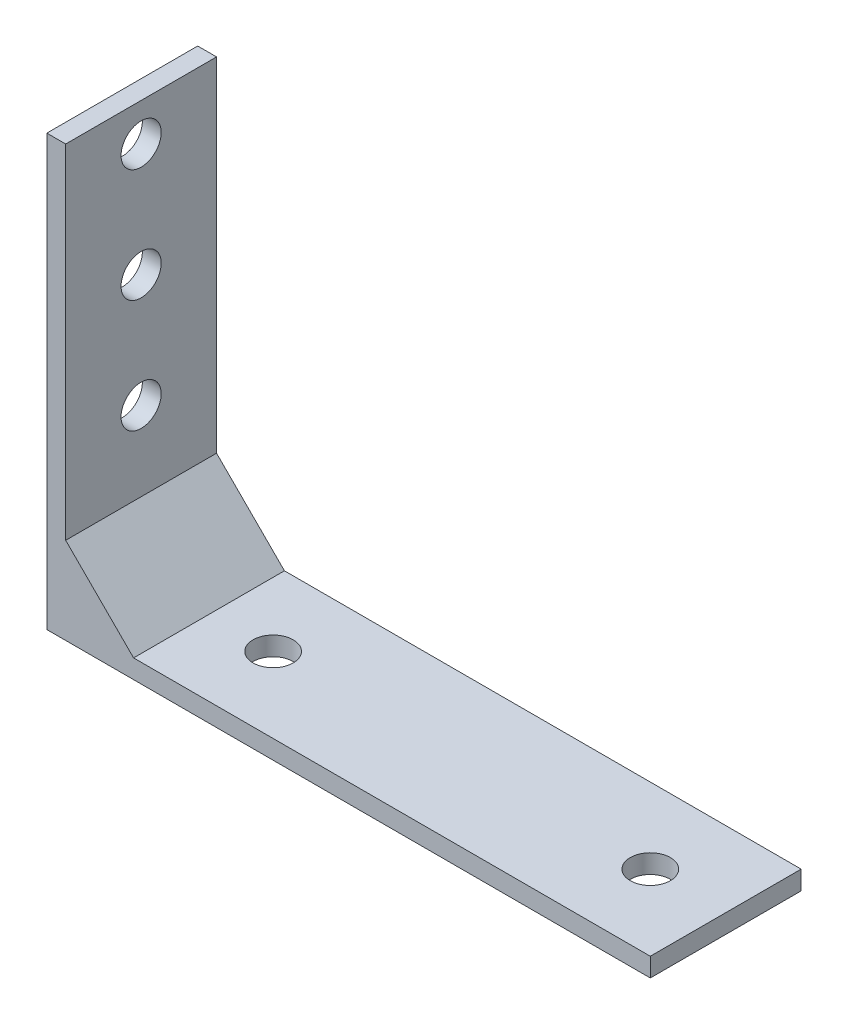
ISO-10303-21;
HEADER;
FILE_DESCRIPTION(('STEP AP214'),'2;1');
FILE_NAME('part.step','',(''),(''),'','','');
FILE_SCHEMA(('AUTOMOTIVE_DESIGN { 1 0 10303 214 1 1 1 1 }'));
ENDSEC;
DATA;
#1=APPLICATION_CONTEXT('core data for automotive mechanical design processes');
#2=APPLICATION_PROTOCOL_DEFINITION('international standard','automotive_design',2000,#1);
#3=PRODUCT_CONTEXT('',#1,'mechanical');
#4=PRODUCT('Part','Part','',(#3));
#5=PRODUCT_RELATED_PRODUCT_CATEGORY('part','',(#4));
#6=PRODUCT_DEFINITION_FORMATION('','',#4);
#7=PRODUCT_DEFINITION_CONTEXT('part definition',#1,'design');
#8=PRODUCT_DEFINITION('design','',#6,#7);
#9=PRODUCT_DEFINITION_SHAPE('','',#8);
#10=(LENGTH_UNIT() NAMED_UNIT(*) SI_UNIT(.MILLI.,.METRE.));
#11=(NAMED_UNIT(*) PLANE_ANGLE_UNIT() SI_UNIT($,.RADIAN.));
#12=(NAMED_UNIT(*) SI_UNIT($,.STERADIAN.) SOLID_ANGLE_UNIT());
#13=UNCERTAINTY_MEASURE_WITH_UNIT(LENGTH_MEASURE(1.E-05),#10,'distance_accuracy_value','');
#14=(GEOMETRIC_REPRESENTATION_CONTEXT(3) GLOBAL_UNCERTAINTY_ASSIGNED_CONTEXT((#13)) GLOBAL_UNIT_ASSIGNED_CONTEXT((#10,
#11,#12)) REPRESENTATION_CONTEXT('',''));
#15=CARTESIAN_POINT('',(0.,0.,0.));
#16=DIRECTION('',(0.,0.,1.));
#17=DIRECTION('',(1.,0.,0.));
#18=AXIS2_PLACEMENT_3D('',#15,#16,#17);
#19=CARTESIAN_POINT('',(0.,0.,25.4));
#20=DIRECTION('',(0.,1.,0.));
#21=DIRECTION('',(0.,0.,1.));
#22=AXIS2_PLACEMENT_3D('',#19,#20,#21);
#23=PLANE('',#22);
#24=CARTESIAN_POINT('',(25.4,0.,12.7));
#25=DIRECTION('',(0.,1.,0.));
#26=DIRECTION('',(0.,0.,1.));
#27=AXIS2_PLACEMENT_3D('',#24,#25,#26);
#28=CIRCLE('',#27,3.3782);
#29=CARTESIAN_POINT('',(25.4,0.,16.0782));
#30=VERTEX_POINT('',#29);
#31=EDGE_CURVE('E170',#30,#30,#28,.T.);
#32=ORIENTED_EDGE('',*,*,#31,.T.);
#33=EDGE_LOOP('',(#32));
#34=FACE_BOUND('',#33,.T.);
#35=CARTESIAN_POINT('',(88.9,0.,12.7));
#36=DIRECTION('',(0.,1.,0.));
#37=DIRECTION('',(0.,0.,1.));
#38=AXIS2_PLACEMENT_3D('',#35,#36,#37);
#39=CIRCLE('',#38,3.37819999999999);
#40=CARTESIAN_POINT('',(88.9,0.,16.0782));
#41=VERTEX_POINT('',#40);
#42=EDGE_CURVE('E130',#41,#41,#39,.T.);
#43=ORIENTED_EDGE('',*,*,#42,.T.);
#44=EDGE_LOOP('',(#43));
#45=FACE_BOUND('',#44,.T.);
#46=DIRECTION('',(1.,0.,0.));
#47=VECTOR('',#46,1.);
#48=CARTESIAN_POINT('',(0.,0.,0.));
#49=LINE('',#48,#47);
#50=CARTESIAN_POINT('',(0.,0.,0.));
#51=VERTEX_POINT('',#50);
#52=CARTESIAN_POINT('',(101.6,0.,0.));
#53=VERTEX_POINT('',#52);
#54=EDGE_CURVE('E127',#51,#53,#49,.T.);
#55=ORIENTED_EDGE('',*,*,#54,.T.);
#56=DIRECTION('',(0.,0.,-1.));
#57=VECTOR('',#56,1.);
#58=CARTESIAN_POINT('',(101.6,0.,25.4));
#59=LINE('',#58,#57);
#60=CARTESIAN_POINT('',(101.6,0.,25.4));
#61=VERTEX_POINT('',#60);
#62=EDGE_CURVE('E11',#61,#53,#59,.T.);
#63=ORIENTED_EDGE('',*,*,#62,.F.);
#64=DIRECTION('',(1.,0.,0.));
#65=VECTOR('',#64,1.);
#66=CARTESIAN_POINT('',(0.,0.,25.4));
#67=LINE('',#66,#65);
#68=CARTESIAN_POINT('',(0.,0.,25.4));
#69=VERTEX_POINT('',#68);
#70=EDGE_CURVE('E141',#69,#61,#67,.T.);
#71=ORIENTED_EDGE('',*,*,#70,.F.);
#72=DIRECTION('',(0.,0.,-1.));
#73=VECTOR('',#72,1.);
#74=CARTESIAN_POINT('',(0.,0.,25.4));
#75=LINE('',#74,#73);
#76=EDGE_CURVE('E58',#69,#51,#75,.T.);
#77=ORIENTED_EDGE('',*,*,#76,.T.);
#78=EDGE_LOOP('',(#55,#63,#71,#77));
#79=FACE_BOUND('',#78,.T.);
#80=ADVANCED_FACE('F35',(#34,#45,#79),#23,.F.);
#81=CARTESIAN_POINT('',(101.6,0.,25.4));
#82=DIRECTION('',(-1.,0.,0.));
#83=DIRECTION('',(0.,0.,1.));
#84=AXIS2_PLACEMENT_3D('',#81,#82,#83);
#85=PLANE('',#84);
#86=DIRECTION('',(0.,1.,0.));
#87=VECTOR('',#86,1.);
#88=CARTESIAN_POINT('',(101.6,0.,0.));
#89=LINE('',#88,#87);
#90=CARTESIAN_POINT('',(101.6,3.175,0.));
#91=VERTEX_POINT('',#90);
#92=EDGE_CURVE('E129',#53,#91,#89,.T.);
#93=ORIENTED_EDGE('',*,*,#92,.T.);
#94=DIRECTION('',(0.,0.,-1.));
#95=VECTOR('',#94,1.);
#96=CARTESIAN_POINT('',(101.6,3.175,25.4));
#97=LINE('',#96,#95);
#98=CARTESIAN_POINT('',(101.6,3.175,25.4));
#99=VERTEX_POINT('',#98);
#100=EDGE_CURVE('E42',#99,#91,#97,.T.);
#101=ORIENTED_EDGE('',*,*,#100,.F.);
#102=DIRECTION('',(0.,1.,0.));
#103=VECTOR('',#102,1.);
#104=CARTESIAN_POINT('',(101.6,0.,25.4));
#105=LINE('',#104,#103);
#106=EDGE_CURVE('E87',#61,#99,#105,.T.);
#107=ORIENTED_EDGE('',*,*,#106,.F.);
#108=ORIENTED_EDGE('',*,*,#62,.T.);
#109=EDGE_LOOP('',(#93,#101,#107,#108));
#110=FACE_BOUND('',#109,.T.);
#111=ADVANCED_FACE('F149',(#110),#85,.F.);
#112=CARTESIAN_POINT('',(0.,3.175,25.4));
#113=DIRECTION('',(0.,1.,0.));
#114=DIRECTION('',(-1.,0.,0.));
#115=AXIS2_PLACEMENT_3D('',#112,#113,#114);
#116=PLANE('',#115);
#117=DIRECTION('',(0.,0.,1.));
#118=VECTOR('',#117,1.);
#119=CARTESIAN_POINT('',(14.6049999999999,3.175,0.));
#120=LINE('',#119,#118);
#121=CARTESIAN_POINT('',(14.6049999999999,3.175,0.));
#122=VERTEX_POINT('',#121);
#123=CARTESIAN_POINT('',(14.6049999999999,3.175,25.4));
#124=VERTEX_POINT('',#123);
#125=EDGE_CURVE('E158',#122,#124,#120,.T.);
#126=ORIENTED_EDGE('',*,*,#125,.T.);
#127=DIRECTION('',(1.,0.,0.));
#128=VECTOR('',#127,1.);
#129=CARTESIAN_POINT('',(0.,3.175,25.4));
#130=LINE('',#129,#128);
#131=EDGE_CURVE('E110',#124,#99,#130,.T.);
#132=ORIENTED_EDGE('',*,*,#131,.T.);
#133=ORIENTED_EDGE('',*,*,#100,.T.);
#134=DIRECTION('',(1.,0.,0.));
#135=VECTOR('',#134,1.);
#136=CARTESIAN_POINT('',(0.,3.175,0.));
#137=LINE('',#136,#135);
#138=EDGE_CURVE('E133',#122,#91,#137,.T.);
#139=ORIENTED_EDGE('',*,*,#138,.F.);
#140=EDGE_LOOP('',(#126,#132,#133,#139));
#141=FACE_BOUND('',#140,.T.);
#142=CARTESIAN_POINT('',(25.4,3.175,12.7));
#143=DIRECTION('',(0.,1.,0.));
#144=DIRECTION('',(0.,0.,1.));
#145=AXIS2_PLACEMENT_3D('',#142,#143,#144);
#146=CIRCLE('',#145,3.3782);
#147=CARTESIAN_POINT('',(25.4,3.175,16.0782));
#148=VERTEX_POINT('',#147);
#149=EDGE_CURVE('E173',#148,#148,#146,.T.);
#150=ORIENTED_EDGE('',*,*,#149,.F.);
#151=EDGE_LOOP('',(#150));
#152=FACE_BOUND('',#151,.T.);
#153=CARTESIAN_POINT('',(88.9,3.175,12.7));
#154=DIRECTION('',(0.,1.,0.));
#155=DIRECTION('',(0.,0.,1.));
#156=AXIS2_PLACEMENT_3D('',#153,#154,#155);
#157=CIRCLE('',#156,3.37819999999999);
#158=CARTESIAN_POINT('',(88.9,3.175,16.0782));
#159=VERTEX_POINT('',#158);
#160=EDGE_CURVE('E167',#159,#159,#157,.T.);
#161=ORIENTED_EDGE('',*,*,#160,.F.);
#162=EDGE_LOOP('',(#161));
#163=FACE_BOUND('',#162,.T.);
#164=ADVANCED_FACE('F147',(#141,#152,#163),#116,.T.);
#165=CARTESIAN_POINT('',(3.175,0.,25.4));
#166=DIRECTION('',(-1.,0.,0.));
#167=DIRECTION('',(0.,-1.,0.));
#168=AXIS2_PLACEMENT_3D('',#165,#166,#167);
#169=PLANE('',#168);
#170=CARTESIAN_POINT('',(3.175,66.04,12.7));
#171=DIRECTION('',(-1.,0.,0.));
#172=DIRECTION('',(0.,-1.,0.));
#173=AXIS2_PLACEMENT_3D('',#170,#171,#172);
#174=CIRCLE('',#173,3.3782);
#175=CARTESIAN_POINT('',(3.175,62.6618,12.7));
#176=VERTEX_POINT('',#175);
#177=EDGE_CURVE('E188',#176,#176,#174,.T.);
#178=ORIENTED_EDGE('',*,*,#177,.T.);
#179=EDGE_LOOP('',(#178));
#180=FACE_BOUND('',#179,.T.);
#181=CARTESIAN_POINT('',(3.175,46.99,12.7));
#182=DIRECTION('',(-1.,0.,0.));
#183=DIRECTION('',(0.,-1.,0.));
#184=AXIS2_PLACEMENT_3D('',#181,#182,#183);
#185=CIRCLE('',#184,3.3782);
#186=CARTESIAN_POINT('',(3.175,43.6118,12.7));
#187=VERTEX_POINT('',#186);
#188=EDGE_CURVE('E182',#187,#187,#185,.T.);
#189=ORIENTED_EDGE('',*,*,#188,.T.);
#190=EDGE_LOOP('',(#189));
#191=FACE_BOUND('',#190,.T.);
#192=CARTESIAN_POINT('',(3.175,27.94,12.7));
#193=DIRECTION('',(-1.,0.,0.));
#194=DIRECTION('',(0.,-1.,0.));
#195=AXIS2_PLACEMENT_3D('',#192,#193,#194);
#196=CIRCLE('',#195,3.3782);
#197=CARTESIAN_POINT('',(3.175,24.5618,12.7));
#198=VERTEX_POINT('',#197);
#199=EDGE_CURVE('E176',#198,#198,#196,.T.);
#200=ORIENTED_EDGE('',*,*,#199,.T.);
#201=EDGE_LOOP('',(#200));
#202=FACE_BOUND('',#201,.T.);
#203=DIRECTION('',(0.,1.,0.));
#204=VECTOR('',#203,1.);
#205=CARTESIAN_POINT('',(3.175,0.,25.4));
#206=LINE('',#205,#204);
#207=CARTESIAN_POINT('',(3.175,14.605,25.4));
#208=VERTEX_POINT('',#207);
#209=CARTESIAN_POINT('',(3.175,72.39,25.4));
#210=VERTEX_POINT('',#209);
#211=EDGE_CURVE('E99',#208,#210,#206,.T.);
#212=ORIENTED_EDGE('',*,*,#211,.F.);
#213=DIRECTION('',(0.,0.,1.));
#214=VECTOR('',#213,1.);
#215=CARTESIAN_POINT('',(3.175,14.605,0.));
#216=LINE('',#215,#214);
#217=CARTESIAN_POINT('',(3.175,14.605,0.));
#218=VERTEX_POINT('',#217);
#219=EDGE_CURVE('E159',#218,#208,#216,.T.);
#220=ORIENTED_EDGE('',*,*,#219,.F.);
#221=DIRECTION('',(0.,1.,0.));
#222=VECTOR('',#221,1.);
#223=CARTESIAN_POINT('',(3.175,0.,0.));
#224=LINE('',#223,#222);
#225=CARTESIAN_POINT('',(3.175,72.39,0.));
#226=VERTEX_POINT('',#225);
#227=EDGE_CURVE('E115',#218,#226,#224,.T.);
#228=ORIENTED_EDGE('',*,*,#227,.T.);
#229=DIRECTION('',(0.,0.,-1.));
#230=VECTOR('',#229,1.);
#231=CARTESIAN_POINT('',(3.175,72.39,25.4));
#232=LINE('',#231,#230);
#233=EDGE_CURVE('E113',#210,#226,#232,.T.);
#234=ORIENTED_EDGE('',*,*,#233,.F.);
#235=EDGE_LOOP('',(#212,#220,#228,#234));
#236=FACE_BOUND('',#235,.T.);
#237=ADVANCED_FACE('F114',(#180,#191,#202,#236),#169,.F.);
#238=CARTESIAN_POINT('',(0.,72.39,25.4));
#239=DIRECTION('',(0.,1.,0.));
#240=DIRECTION('',(0.,0.,1.));
#241=AXIS2_PLACEMENT_3D('',#238,#239,#240);
#242=PLANE('',#241);
#243=DIRECTION('',(1.,0.,0.));
#244=VECTOR('',#243,1.);
#245=CARTESIAN_POINT('',(0.,72.39,0.));
#246=LINE('',#245,#244);
#247=CARTESIAN_POINT('',(0.,72.39,0.));
#248=VERTEX_POINT('',#247);
#249=EDGE_CURVE('E136',#248,#226,#246,.T.);
#250=ORIENTED_EDGE('',*,*,#249,.F.);
#251=DIRECTION('',(0.,0.,-1.));
#252=VECTOR('',#251,1.);
#253=CARTESIAN_POINT('',(0.,72.39,25.4));
#254=LINE('',#253,#252);
#255=CARTESIAN_POINT('',(0.,72.39,25.4));
#256=VERTEX_POINT('',#255);
#257=EDGE_CURVE('E119',#256,#248,#254,.T.);
#258=ORIENTED_EDGE('',*,*,#257,.F.);
#259=DIRECTION('',(1.,0.,0.));
#260=VECTOR('',#259,1.);
#261=CARTESIAN_POINT('',(0.,72.39,25.4));
#262=LINE('',#261,#260);
#263=EDGE_CURVE('E104',#256,#210,#262,.T.);
#264=ORIENTED_EDGE('',*,*,#263,.T.);
#265=ORIENTED_EDGE('',*,*,#233,.T.);
#266=EDGE_LOOP('',(#250,#258,#264,#265));
#267=FACE_BOUND('',#266,.T.);
#268=ADVANCED_FACE('F121',(#267),#242,.T.);
#269=CARTESIAN_POINT('',(0.,0.,25.4));
#270=DIRECTION('',(-1.,0.,0.));
#271=DIRECTION('',(0.,0.,1.));
#272=AXIS2_PLACEMENT_3D('',#269,#270,#271);
#273=PLANE('',#272);
#274=CARTESIAN_POINT('',(0.,66.04,12.7));
#275=DIRECTION('',(-1.,0.,0.));
#276=DIRECTION('',(0.,0.,1.));
#277=AXIS2_PLACEMENT_3D('',#274,#275,#276);
#278=CIRCLE('',#277,3.3782);
#279=CARTESIAN_POINT('',(0.,66.04,16.0782));
#280=VERTEX_POINT('',#279);
#281=EDGE_CURVE('E191',#280,#280,#278,.T.);
#282=ORIENTED_EDGE('',*,*,#281,.F.);
#283=EDGE_LOOP('',(#282));
#284=FACE_BOUND('',#283,.T.);
#285=CARTESIAN_POINT('',(0.,46.99,12.7));
#286=DIRECTION('',(-1.,0.,0.));
#287=DIRECTION('',(0.,0.,1.));
#288=AXIS2_PLACEMENT_3D('',#285,#286,#287);
#289=CIRCLE('',#288,3.3782);
#290=CARTESIAN_POINT('',(0.,46.99,16.0782));
#291=VERTEX_POINT('',#290);
#292=EDGE_CURVE('E185',#291,#291,#289,.T.);
#293=ORIENTED_EDGE('',*,*,#292,.F.);
#294=EDGE_LOOP('',(#293));
#295=FACE_BOUND('',#294,.T.);
#296=CARTESIAN_POINT('',(0.,27.94,12.7));
#297=DIRECTION('',(-1.,0.,0.));
#298=DIRECTION('',(0.,0.,1.));
#299=AXIS2_PLACEMENT_3D('',#296,#297,#298);
#300=CIRCLE('',#299,3.3782);
#301=CARTESIAN_POINT('',(0.,27.94,16.0782));
#302=VERTEX_POINT('',#301);
#303=EDGE_CURVE('E179',#302,#302,#300,.T.);
#304=ORIENTED_EDGE('',*,*,#303,.F.);
#305=EDGE_LOOP('',(#304));
#306=FACE_BOUND('',#305,.T.);
#307=DIRECTION('',(0.,1.,0.));
#308=VECTOR('',#307,1.);
#309=CARTESIAN_POINT('',(0.,0.,0.));
#310=LINE('',#309,#308);
#311=EDGE_CURVE('E138',#51,#248,#310,.T.);
#312=ORIENTED_EDGE('',*,*,#311,.F.);
#313=ORIENTED_EDGE('',*,*,#76,.F.);
#314=DIRECTION('',(0.,1.,0.));
#315=VECTOR('',#314,1.);
#316=CARTESIAN_POINT('',(0.,0.,25.4));
#317=LINE('',#316,#315);
#318=EDGE_CURVE('E122',#69,#256,#317,.T.);
#319=ORIENTED_EDGE('',*,*,#318,.T.);
#320=ORIENTED_EDGE('',*,*,#257,.T.);
#321=EDGE_LOOP('',(#312,#313,#319,#320));
#322=FACE_BOUND('',#321,.T.);
#323=ADVANCED_FACE('F152',(#284,#295,#306,#322),#273,.T.);
#324=CARTESIAN_POINT('',(0.,0.,25.4));
#325=DIRECTION('',(0.,0.,1.));
#326=DIRECTION('',(1.,0.,0.));
#327=AXIS2_PLACEMENT_3D('',#324,#325,#326);
#328=PLANE('',#327);
#329=DIRECTION('',(-0.707106781186544,0.707106781186551,0.));
#330=VECTOR('',#329,1.);
#331=CARTESIAN_POINT('',(3.175,14.605,25.4));
#332=LINE('',#331,#330);
#333=EDGE_CURVE('E107',#124,#208,#332,.T.);
#334=ORIENTED_EDGE('',*,*,#333,.T.);
#335=ORIENTED_EDGE('',*,*,#211,.T.);
#336=ORIENTED_EDGE('',*,*,#263,.F.);
#337=ORIENTED_EDGE('',*,*,#318,.F.);
#338=ORIENTED_EDGE('',*,*,#70,.T.);
#339=ORIENTED_EDGE('',*,*,#106,.T.);
#340=ORIENTED_EDGE('',*,*,#131,.F.);
#341=EDGE_LOOP('',(#334,#335,#336,#337,#338,#339,#340));
#342=FACE_BOUND('',#341,.T.);
#343=ADVANCED_FACE('F101',(#342),#328,.T.);
#344=CARTESIAN_POINT('',(0.,0.,0.));
#345=DIRECTION('',(0.,0.,1.));
#346=DIRECTION('',(1.,0.,0.));
#347=AXIS2_PLACEMENT_3D('',#344,#345,#346);
#348=PLANE('',#347);
#349=ORIENTED_EDGE('',*,*,#227,.F.);
#350=DIRECTION('',(-0.707106781186544,0.707106781186551,0.));
#351=VECTOR('',#350,1.);
#352=CARTESIAN_POINT('',(3.175,14.605,0.));
#353=LINE('',#352,#351);
#354=EDGE_CURVE('E49',#122,#218,#353,.T.);
#355=ORIENTED_EDGE('',*,*,#354,.F.);
#356=ORIENTED_EDGE('',*,*,#138,.T.);
#357=ORIENTED_EDGE('',*,*,#92,.F.);
#358=ORIENTED_EDGE('',*,*,#54,.F.);
#359=ORIENTED_EDGE('',*,*,#311,.T.);
#360=ORIENTED_EDGE('',*,*,#249,.T.);
#361=EDGE_LOOP('',(#349,#355,#356,#357,#358,#359,#360));
#362=FACE_BOUND('',#361,.T.);
#363=ADVANCED_FACE('F151',(#362),#348,.F.);
#364=CARTESIAN_POINT('',(88.9,-22.225,12.7));
#365=DIRECTION('',(0.,1.,0.));
#366=DIRECTION('',(0.,0.,1.));
#367=AXIS2_PLACEMENT_3D('',#364,#365,#366);
#368=CYLINDRICAL_SURFACE('',#367,3.37819999999999);
#369=ORIENTED_EDGE('',*,*,#160,.T.);
#370=EDGE_LOOP('',(#369));
#371=FACE_BOUND('',#370,.T.);
#372=ORIENTED_EDGE('',*,*,#42,.F.);
#373=EDGE_LOOP('',(#372));
#374=FACE_BOUND('',#373,.T.);
#375=ADVANCED_FACE('F234',(#371,#374),#368,.F.);
#376=CARTESIAN_POINT('',(25.4,-22.225,12.7));
#377=DIRECTION('',(0.,1.,0.));
#378=DIRECTION('',(0.,0.,1.));
#379=AXIS2_PLACEMENT_3D('',#376,#377,#378);
#380=CYLINDRICAL_SURFACE('',#379,3.3782);
#381=ORIENTED_EDGE('',*,*,#149,.T.);
#382=EDGE_LOOP('',(#381));
#383=FACE_BOUND('',#382,.T.);
#384=ORIENTED_EDGE('',*,*,#31,.F.);
#385=EDGE_LOOP('',(#384));
#386=FACE_BOUND('',#385,.T.);
#387=ADVANCED_FACE('F211',(#383,#386),#380,.F.);
#388=CARTESIAN_POINT('',(101.6,27.94,12.7));
#389=DIRECTION('',(-1.,0.,0.));
#390=DIRECTION('',(0.,0.,1.));
#391=AXIS2_PLACEMENT_3D('',#388,#389,#390);
#392=CYLINDRICAL_SURFACE('',#391,3.3782);
#393=ORIENTED_EDGE('',*,*,#303,.T.);
#394=EDGE_LOOP('',(#393));
#395=FACE_BOUND('',#394,.T.);
#396=ORIENTED_EDGE('',*,*,#199,.F.);
#397=EDGE_LOOP('',(#396));
#398=FACE_BOUND('',#397,.T.);
#399=ADVANCED_FACE('F207',(#395,#398),#392,.F.);
#400=CARTESIAN_POINT('',(101.6,46.99,12.7));
#401=DIRECTION('',(-1.,0.,0.));
#402=DIRECTION('',(0.,0.,1.));
#403=AXIS2_PLACEMENT_3D('',#400,#401,#402);
#404=CYLINDRICAL_SURFACE('',#403,3.3782);
#405=ORIENTED_EDGE('',*,*,#292,.T.);
#406=EDGE_LOOP('',(#405));
#407=FACE_BOUND('',#406,.T.);
#408=ORIENTED_EDGE('',*,*,#188,.F.);
#409=EDGE_LOOP('',(#408));
#410=FACE_BOUND('',#409,.T.);
#411=ADVANCED_FACE('F210',(#407,#410),#404,.F.);
#412=CARTESIAN_POINT('',(101.6,66.04,12.7));
#413=DIRECTION('',(-1.,0.,0.));
#414=DIRECTION('',(0.,0.,1.));
#415=AXIS2_PLACEMENT_3D('',#412,#413,#414);
#416=CYLINDRICAL_SURFACE('',#415,3.3782);
#417=ORIENTED_EDGE('',*,*,#281,.T.);
#418=EDGE_LOOP('',(#417));
#419=FACE_BOUND('',#418,.T.);
#420=ORIENTED_EDGE('',*,*,#177,.F.);
#421=EDGE_LOOP('',(#420));
#422=FACE_BOUND('',#421,.T.);
#423=ADVANCED_FACE('F197',(#419,#422),#416,.F.);
#424=CARTESIAN_POINT('',(3.175,14.605,0.));
#425=DIRECTION('',(0.707106781186551,0.707106781186544,0.));
#426=DIRECTION('',(-0.707106781186544,0.707106781186551,0.));
#427=AXIS2_PLACEMENT_3D('',#424,#425,#426);
#428=PLANE('',#427);
#429=ORIENTED_EDGE('',*,*,#333,.F.);
#430=ORIENTED_EDGE('',*,*,#125,.F.);
#431=ORIENTED_EDGE('',*,*,#354,.T.);
#432=ORIENTED_EDGE('',*,*,#219,.T.);
#433=EDGE_LOOP('',(#429,#430,#431,#432));
#434=FACE_BOUND('',#433,.T.);
#435=ADVANCED_FACE('F157',(#434),#428,.T.);
#436=CLOSED_SHELL('',(#80,#111,#164,#237,#268,#323,#343,#363,#375,#387,#399,#411,#423,#435));
#437=MANIFOLD_SOLID_BREP('B2',#436);
#438=ADVANCED_BREP_SHAPE_REPRESENTATION('',(#18,#437),#14);
#439=SHAPE_DEFINITION_REPRESENTATION(#9,#438);
ENDSEC;
END-ISO-10303-21;
